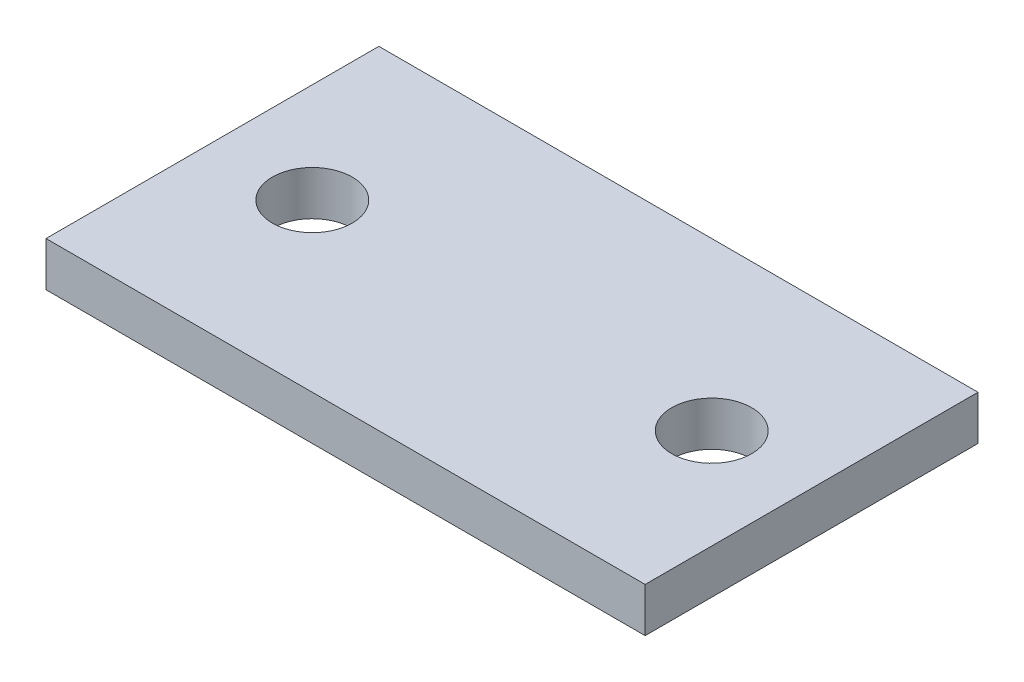
ISO-10303-21;
HEADER;
FILE_DESCRIPTION(('STEP AP214'),'2;1');
FILE_NAME('part.step','',(''),(''),'','','');
FILE_SCHEMA(('AUTOMOTIVE_DESIGN { 1 0 10303 214 1 1 1 1 }'));
ENDSEC;
DATA;
#1=APPLICATION_CONTEXT('core data for automotive mechanical design processes');
#2=APPLICATION_PROTOCOL_DEFINITION('international standard','automotive_design',2000,#1);
#3=PRODUCT_CONTEXT('',#1,'mechanical');
#4=PRODUCT('Part','Part','',(#3));
#5=PRODUCT_RELATED_PRODUCT_CATEGORY('part','',(#4));
#6=PRODUCT_DEFINITION_FORMATION('','',#4);
#7=PRODUCT_DEFINITION_CONTEXT('part definition',#1,'design');
#8=PRODUCT_DEFINITION('design','',#6,#7);
#9=PRODUCT_DEFINITION_SHAPE('','',#8);
#10=(LENGTH_UNIT() NAMED_UNIT(*) SI_UNIT(.MILLI.,.METRE.));
#11=(NAMED_UNIT(*) PLANE_ANGLE_UNIT() SI_UNIT($,.RADIAN.));
#12=(NAMED_UNIT(*) SI_UNIT($,.STERADIAN.) SOLID_ANGLE_UNIT());
#13=UNCERTAINTY_MEASURE_WITH_UNIT(LENGTH_MEASURE(1.E-05),#10,'distance_accuracy_value','');
#14=(GEOMETRIC_REPRESENTATION_CONTEXT(3) GLOBAL_UNCERTAINTY_ASSIGNED_CONTEXT((#13)) GLOBAL_UNIT_ASSIGNED_CONTEXT((#10,
#11,#12)) REPRESENTATION_CONTEXT('',''));
#15=CARTESIAN_POINT('',(0.,0.,0.));
#16=DIRECTION('',(0.,0.,1.));
#17=DIRECTION('',(1.,0.,0.));
#18=AXIS2_PLACEMENT_3D('',#15,#16,#17);
#19=CARTESIAN_POINT('',(0.,1.,0.));
#20=DIRECTION('',(0.,1.,0.));
#21=DIRECTION('',(0.,0.,1.));
#22=AXIS2_PLACEMENT_3D('',#19,#20,#21);
#23=PLANE('',#22);
#24=CARTESIAN_POINT('',(-4.5,1.,0.));
#25=DIRECTION('',(0.,1.,0.));
#26=DIRECTION('',(0.,0.,1.));
#27=AXIS2_PLACEMENT_3D('',#24,#25,#26);
#28=CIRCLE('',#27,0.9);
#29=CARTESIAN_POINT('',(-4.5,1.,0.9));
#30=VERTEX_POINT('',#29);
#31=EDGE_CURVE('E99',#30,#30,#28,.T.);
#32=ORIENTED_EDGE('',*,*,#31,.F.);
#33=EDGE_LOOP('',(#32));
#34=FACE_BOUND('',#33,.T.);
#35=DIRECTION('',(0.,0.,1.));
#36=VECTOR('',#35,1.);
#37=CARTESIAN_POINT('',(-6.75,1.,-3.75));
#38=LINE('',#37,#36);
#39=CARTESIAN_POINT('',(-6.75,1.,-3.75));
#40=VERTEX_POINT('',#39);
#41=CARTESIAN_POINT('',(-6.75,1.,3.75));
#42=VERTEX_POINT('',#41);
#43=EDGE_CURVE('E84',#40,#42,#38,.T.);
#44=ORIENTED_EDGE('',*,*,#43,.T.);
#45=DIRECTION('',(1.,0.,0.));
#46=VECTOR('',#45,1.);
#47=CARTESIAN_POINT('',(-6.75,1.,3.75));
#48=LINE('',#47,#46);
#49=CARTESIAN_POINT('',(6.75,1.,3.75));
#50=VERTEX_POINT('',#49);
#51=EDGE_CURVE('E79',#42,#50,#48,.T.);
#52=ORIENTED_EDGE('',*,*,#51,.T.);
#53=DIRECTION('',(0.,0.,-1.));
#54=VECTOR('',#53,1.);
#55=CARTESIAN_POINT('',(6.75,1.,-3.75));
#56=LINE('',#55,#54);
#57=CARTESIAN_POINT('',(6.75,1.,-3.75));
#58=VERTEX_POINT('',#57);
#59=EDGE_CURVE('E82',#50,#58,#56,.T.);
#60=ORIENTED_EDGE('',*,*,#59,.T.);
#61=DIRECTION('',(-1.,0.,0.));
#62=VECTOR('',#61,1.);
#63=CARTESIAN_POINT('',(-6.75,1.,-3.75));
#64=LINE('',#63,#62);
#65=EDGE_CURVE('E49',#58,#40,#64,.T.);
#66=ORIENTED_EDGE('',*,*,#65,.T.);
#67=EDGE_LOOP('',(#44,#52,#60,#66));
#68=FACE_BOUND('',#67,.T.);
#69=CARTESIAN_POINT('',(4.5,1.,0.));
#70=DIRECTION('',(0.,1.,0.));
#71=DIRECTION('',(0.,0.,1.));
#72=AXIS2_PLACEMENT_3D('',#69,#70,#71);
#73=CIRCLE('',#72,0.899999999999999);
#74=CARTESIAN_POINT('',(4.5,1.,0.899999999999999));
#75=VERTEX_POINT('',#74);
#76=EDGE_CURVE('E114',#75,#75,#73,.T.);
#77=ORIENTED_EDGE('',*,*,#76,.F.);
#78=EDGE_LOOP('',(#77));
#79=FACE_BOUND('',#78,.T.);
#80=ADVANCED_FACE('F32',(#34,#68,#79),#23,.T.);
#81=CARTESIAN_POINT('',(0.,0.,0.));
#82=DIRECTION('',(0.,1.,0.));
#83=DIRECTION('',(0.,0.,1.));
#84=AXIS2_PLACEMENT_3D('',#81,#82,#83);
#85=PLANE('',#84);
#86=DIRECTION('',(0.,0.,1.));
#87=VECTOR('',#86,1.);
#88=CARTESIAN_POINT('',(-6.75,0.,-3.75));
#89=LINE('',#88,#87);
#90=CARTESIAN_POINT('',(-6.75,0.,-3.75));
#91=VERTEX_POINT('',#90);
#92=CARTESIAN_POINT('',(-6.75,0.,3.75));
#93=VERTEX_POINT('',#92);
#94=EDGE_CURVE('E96',#91,#93,#89,.T.);
#95=ORIENTED_EDGE('',*,*,#94,.F.);
#96=DIRECTION('',(-1.,0.,0.));
#97=VECTOR('',#96,1.);
#98=CARTESIAN_POINT('',(-6.75,0.,-3.75));
#99=LINE('',#98,#97);
#100=CARTESIAN_POINT('',(6.75,0.,-3.75));
#101=VERTEX_POINT('',#100);
#102=EDGE_CURVE('E72',#101,#91,#99,.T.);
#103=ORIENTED_EDGE('',*,*,#102,.F.);
#104=DIRECTION('',(0.,0.,-1.));
#105=VECTOR('',#104,1.);
#106=CARTESIAN_POINT('',(6.75,0.,-3.75));
#107=LINE('',#106,#105);
#108=CARTESIAN_POINT('',(6.75,0.,3.75));
#109=VERTEX_POINT('',#108);
#110=EDGE_CURVE('E66',#109,#101,#107,.T.);
#111=ORIENTED_EDGE('',*,*,#110,.F.);
#112=DIRECTION('',(1.,0.,0.));
#113=VECTOR('',#112,1.);
#114=CARTESIAN_POINT('',(-6.75,0.,3.75));
#115=LINE('',#114,#113);
#116=EDGE_CURVE('E88',#93,#109,#115,.T.);
#117=ORIENTED_EDGE('',*,*,#116,.F.);
#118=EDGE_LOOP('',(#95,#103,#111,#117));
#119=FACE_BOUND('',#118,.T.);
#120=CARTESIAN_POINT('',(-4.5,0.,0.));
#121=DIRECTION('',(0.,1.,0.));
#122=DIRECTION('',(0.,0.,1.));
#123=AXIS2_PLACEMENT_3D('',#120,#121,#122);
#124=CIRCLE('',#123,0.9);
#125=CARTESIAN_POINT('',(-4.5,0.,0.9));
#126=VERTEX_POINT('',#125);
#127=EDGE_CURVE('E111',#126,#126,#124,.T.);
#128=ORIENTED_EDGE('',*,*,#127,.T.);
#129=EDGE_LOOP('',(#128));
#130=FACE_BOUND('',#129,.T.);
#131=CARTESIAN_POINT('',(4.5,0.,0.));
#132=DIRECTION('',(0.,1.,0.));
#133=DIRECTION('',(0.,0.,1.));
#134=AXIS2_PLACEMENT_3D('',#131,#132,#133);
#135=CIRCLE('',#134,0.899999999999999);
#136=CARTESIAN_POINT('',(4.5,0.,0.899999999999999));
#137=VERTEX_POINT('',#136);
#138=EDGE_CURVE('E117',#137,#137,#135,.T.);
#139=ORIENTED_EDGE('',*,*,#138,.T.);
#140=EDGE_LOOP('',(#139));
#141=FACE_BOUND('',#140,.T.);
#142=ADVANCED_FACE('F107',(#119,#130,#141),#85,.F.);
#143=CARTESIAN_POINT('',(-6.75,1.,-3.75));
#144=DIRECTION('',(1.,0.,0.));
#145=DIRECTION('',(0.,0.,-1.));
#146=AXIS2_PLACEMENT_3D('',#143,#144,#145);
#147=PLANE('',#146);
#148=ORIENTED_EDGE('',*,*,#94,.T.);
#149=DIRECTION('',(0.,-1.,0.));
#150=VECTOR('',#149,1.);
#151=CARTESIAN_POINT('',(-6.75,1.,3.75));
#152=LINE('',#151,#150);
#153=EDGE_CURVE('E11',#42,#93,#152,.T.);
#154=ORIENTED_EDGE('',*,*,#153,.F.);
#155=ORIENTED_EDGE('',*,*,#43,.F.);
#156=DIRECTION('',(0.,-1.,0.));
#157=VECTOR('',#156,1.);
#158=CARTESIAN_POINT('',(-6.75,1.,-3.75));
#159=LINE('',#158,#157);
#160=EDGE_CURVE('E92',#40,#91,#159,.T.);
#161=ORIENTED_EDGE('',*,*,#160,.T.);
#162=EDGE_LOOP('',(#148,#154,#155,#161));
#163=FACE_BOUND('',#162,.T.);
#164=ADVANCED_FACE('F34',(#163),#147,.F.);
#165=CARTESIAN_POINT('',(-6.75,1.,3.75));
#166=DIRECTION('',(0.,0.,-1.));
#167=DIRECTION('',(-1.,0.,0.));
#168=AXIS2_PLACEMENT_3D('',#165,#166,#167);
#169=PLANE('',#168);
#170=ORIENTED_EDGE('',*,*,#116,.T.);
#171=DIRECTION('',(0.,-1.,0.));
#172=VECTOR('',#171,1.);
#173=CARTESIAN_POINT('',(6.75,1.,3.75));
#174=LINE('',#173,#172);
#175=EDGE_CURVE('E41',#50,#109,#174,.T.);
#176=ORIENTED_EDGE('',*,*,#175,.F.);
#177=ORIENTED_EDGE('',*,*,#51,.F.);
#178=ORIENTED_EDGE('',*,*,#153,.T.);
#179=EDGE_LOOP('',(#170,#176,#177,#178));
#180=FACE_BOUND('',#179,.T.);
#181=ADVANCED_FACE('F87',(#180),#169,.F.);
#182=CARTESIAN_POINT('',(6.75,1.,-3.75));
#183=DIRECTION('',(-1.,0.,0.));
#184=DIRECTION('',(0.,0.,1.));
#185=AXIS2_PLACEMENT_3D('',#182,#183,#184);
#186=PLANE('',#185);
#187=ORIENTED_EDGE('',*,*,#110,.T.);
#188=DIRECTION('',(0.,-1.,0.));
#189=VECTOR('',#188,1.);
#190=CARTESIAN_POINT('',(6.75,1.,-3.75));
#191=LINE('',#190,#189);
#192=EDGE_CURVE('E89',#58,#101,#191,.T.);
#193=ORIENTED_EDGE('',*,*,#192,.F.);
#194=ORIENTED_EDGE('',*,*,#59,.F.);
#195=ORIENTED_EDGE('',*,*,#175,.T.);
#196=EDGE_LOOP('',(#187,#193,#194,#195));
#197=FACE_BOUND('',#196,.T.);
#198=ADVANCED_FACE('F90',(#197),#186,.F.);
#199=CARTESIAN_POINT('',(-6.75,1.,-3.75));
#200=DIRECTION('',(0.,0.,1.));
#201=DIRECTION('',(1.,0.,0.));
#202=AXIS2_PLACEMENT_3D('',#199,#200,#201);
#203=PLANE('',#202);
#204=ORIENTED_EDGE('',*,*,#102,.T.);
#205=ORIENTED_EDGE('',*,*,#160,.F.);
#206=ORIENTED_EDGE('',*,*,#65,.F.);
#207=ORIENTED_EDGE('',*,*,#192,.T.);
#208=EDGE_LOOP('',(#204,#205,#206,#207));
#209=FACE_BOUND('',#208,.T.);
#210=ADVANCED_FACE('F104',(#209),#203,.F.);
#211=CARTESIAN_POINT('',(-4.5,1.,0.));
#212=DIRECTION('',(0.,-1.,0.));
#213=DIRECTION('',(0.,0.,-1.));
#214=AXIS2_PLACEMENT_3D('',#211,#212,#213);
#215=CYLINDRICAL_SURFACE('',#214,0.9);
#216=ORIENTED_EDGE('',*,*,#31,.T.);
#217=EDGE_LOOP('',(#216));
#218=FACE_BOUND('',#217,.T.);
#219=ORIENTED_EDGE('',*,*,#127,.F.);
#220=EDGE_LOOP('',(#219));
#221=FACE_BOUND('',#220,.T.);
#222=ADVANCED_FACE('F134',(#218,#221),#215,.F.);
#223=CARTESIAN_POINT('',(4.5,1.,0.));
#224=DIRECTION('',(0.,-1.,0.));
#225=DIRECTION('',(0.,0.,-1.));
#226=AXIS2_PLACEMENT_3D('',#223,#224,#225);
#227=CYLINDRICAL_SURFACE('',#226,0.899999999999999);
#228=ORIENTED_EDGE('',*,*,#76,.T.);
#229=EDGE_LOOP('',(#228));
#230=FACE_BOUND('',#229,.T.);
#231=ORIENTED_EDGE('',*,*,#138,.F.);
#232=EDGE_LOOP('',(#231));
#233=FACE_BOUND('',#232,.T.);
#234=ADVANCED_FACE('F123',(#230,#233),#227,.F.);
#235=CLOSED_SHELL('',(#80,#142,#164,#181,#198,#210,#222,#234));
#236=MANIFOLD_SOLID_BREP('B2',#235);
#237=ADVANCED_BREP_SHAPE_REPRESENTATION('',(#18,#236),#14);
#238=SHAPE_DEFINITION_REPRESENTATION(#9,#237);
ENDSEC;
END-ISO-10303-21;
